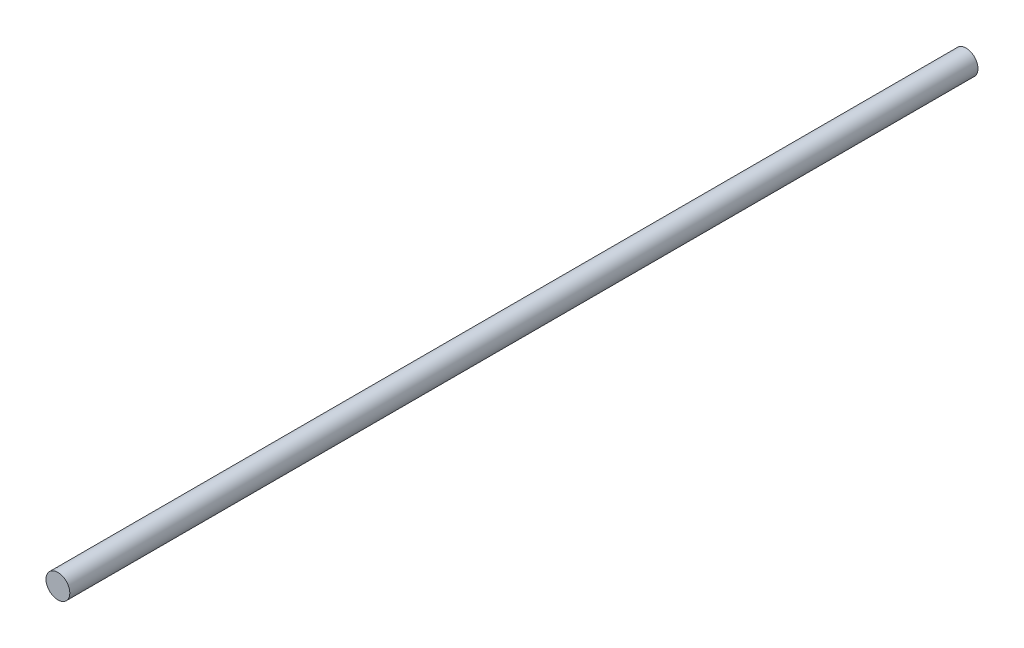
ISO-10303-21;
HEADER;
FILE_DESCRIPTION(('STEP AP214'),'2;1');
FILE_NAME('part.step','',(''),(''),'','','');
FILE_SCHEMA(('AUTOMOTIVE_DESIGN { 1 0 10303 214 1 1 1 1 }'));
ENDSEC;
DATA;
#1=APPLICATION_CONTEXT('core data for automotive mechanical design processes');
#2=APPLICATION_PROTOCOL_DEFINITION('international standard','automotive_design',2000,#1);
#3=PRODUCT_CONTEXT('',#1,'mechanical');
#4=PRODUCT('Part','Part','',(#3));
#5=PRODUCT_RELATED_PRODUCT_CATEGORY('part','',(#4));
#6=PRODUCT_DEFINITION_FORMATION('','',#4);
#7=PRODUCT_DEFINITION_CONTEXT('part definition',#1,'design');
#8=PRODUCT_DEFINITION('design','',#6,#7);
#9=PRODUCT_DEFINITION_SHAPE('','',#8);
#10=(LENGTH_UNIT() NAMED_UNIT(*) SI_UNIT(.MILLI.,.METRE.));
#11=(NAMED_UNIT(*) PLANE_ANGLE_UNIT() SI_UNIT($,.RADIAN.));
#12=(NAMED_UNIT(*) SI_UNIT($,.STERADIAN.) SOLID_ANGLE_UNIT());
#13=UNCERTAINTY_MEASURE_WITH_UNIT(LENGTH_MEASURE(1.E-05),#10,'distance_accuracy_value','');
#14=(GEOMETRIC_REPRESENTATION_CONTEXT(3) GLOBAL_UNCERTAINTY_ASSIGNED_CONTEXT((#13)) GLOBAL_UNIT_ASSIGNED_CONTEXT((#10,
#11,#12)) REPRESENTATION_CONTEXT('',''));
#15=CARTESIAN_POINT('',(0.,0.,0.));
#16=DIRECTION('',(0.,0.,1.));
#17=DIRECTION('',(1.,0.,0.));
#18=AXIS2_PLACEMENT_3D('',#15,#16,#17);
#19=CARTESIAN_POINT('',(0.,0.,381.));
#20=DIRECTION('',(0.,0.,-1.));
#21=DIRECTION('',(-1.,0.,0.));
#22=AXIS2_PLACEMENT_3D('',#19,#20,#21);
#23=CYLINDRICAL_SURFACE('',#22,5.);
#24=CARTESIAN_POINT('',(0.,0.,381.));
#25=DIRECTION('',(0.,0.,1.));
#26=DIRECTION('',(1.,0.,0.));
#27=AXIS2_PLACEMENT_3D('',#24,#25,#26);
#28=CIRCLE('',#27,5.);
#29=CARTESIAN_POINT('',(5.,0.,381.));
#30=VERTEX_POINT('',#29);
#31=EDGE_CURVE('E10',#30,#30,#28,.T.);
#32=ORIENTED_EDGE('',*,*,#31,.F.);
#33=EDGE_LOOP('',(#32));
#34=FACE_BOUND('',#33,.T.);
#35=CARTESIAN_POINT('',(0.,0.,0.));
#36=DIRECTION('',(0.,0.,1.));
#37=DIRECTION('',(1.,0.,0.));
#38=AXIS2_PLACEMENT_3D('',#35,#36,#37);
#39=CIRCLE('',#38,5.);
#40=CARTESIAN_POINT('',(5.,0.,0.));
#41=VERTEX_POINT('',#40);
#42=EDGE_CURVE('E35',#41,#41,#39,.T.);
#43=ORIENTED_EDGE('',*,*,#42,.T.);
#44=EDGE_LOOP('',(#43));
#45=FACE_BOUND('',#44,.T.);
#46=ADVANCED_FACE('F32',(#34,#45),#23,.T.);
#47=CARTESIAN_POINT('',(0.,0.,381.));
#48=DIRECTION('',(0.,0.,1.));
#49=DIRECTION('',(1.,0.,0.));
#50=AXIS2_PLACEMENT_3D('',#47,#48,#49);
#51=PLANE('',#50);
#52=ORIENTED_EDGE('',*,*,#31,.T.);
#53=EDGE_LOOP('',(#52));
#54=FACE_BOUND('',#53,.T.);
#55=ADVANCED_FACE('F47',(#54),#51,.T.);
#56=CARTESIAN_POINT('',(0.,0.,0.));
#57=DIRECTION('',(0.,0.,1.));
#58=DIRECTION('',(1.,0.,0.));
#59=AXIS2_PLACEMENT_3D('',#56,#57,#58);
#60=PLANE('',#59);
#61=ORIENTED_EDGE('',*,*,#42,.F.);
#62=EDGE_LOOP('',(#61));
#63=FACE_BOUND('',#62,.T.);
#64=ADVANCED_FACE('F45',(#63),#60,.F.);
#65=CLOSED_SHELL('',(#46,#55,#64));
#66=MANIFOLD_SOLID_BREP('B2',#65);
#67=ADVANCED_BREP_SHAPE_REPRESENTATION('',(#18,#66),#14);
#68=SHAPE_DEFINITION_REPRESENTATION(#9,#67);
ENDSEC;
END-ISO-10303-21;
